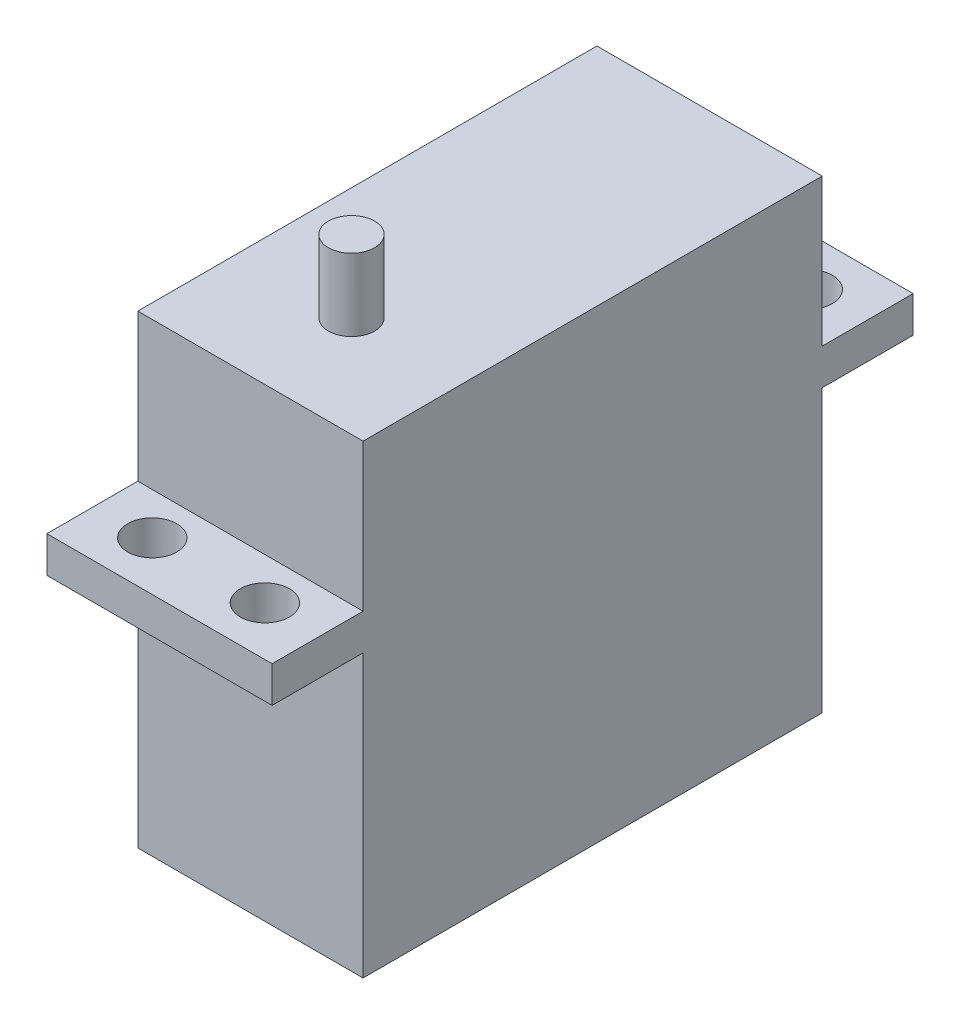
ISO-10303-21;
HEADER;
FILE_DESCRIPTION(('STEP AP214'),'2;1');
FILE_NAME('part.step','',(''),(''),'','','');
FILE_SCHEMA(('AUTOMOTIVE_DESIGN { 1 0 10303 214 1 1 1 1 }'));
ENDSEC;
DATA;
#1=APPLICATION_CONTEXT('core data for automotive mechanical design processes');
#2=APPLICATION_PROTOCOL_DEFINITION('international standard','automotive_design',2000,#1);
#3=PRODUCT_CONTEXT('',#1,'mechanical');
#4=PRODUCT('Part','Part','',(#3));
#5=PRODUCT_RELATED_PRODUCT_CATEGORY('part','',(#4));
#6=PRODUCT_DEFINITION_FORMATION('','',#4);
#7=PRODUCT_DEFINITION_CONTEXT('part definition',#1,'design');
#8=PRODUCT_DEFINITION('design','',#6,#7);
#9=PRODUCT_DEFINITION_SHAPE('','',#8);
#10=(LENGTH_UNIT() NAMED_UNIT(*) SI_UNIT(.MILLI.,.METRE.));
#11=(NAMED_UNIT(*) PLANE_ANGLE_UNIT() SI_UNIT($,.RADIAN.));
#12=(NAMED_UNIT(*) SI_UNIT($,.STERADIAN.) SOLID_ANGLE_UNIT());
#13=UNCERTAINTY_MEASURE_WITH_UNIT(LENGTH_MEASURE(1.E-05),#10,'distance_accuracy_value','');
#14=(GEOMETRIC_REPRESENTATION_CONTEXT(3) GLOBAL_UNCERTAINTY_ASSIGNED_CONTEXT((#13)) GLOBAL_UNIT_ASSIGNED_CONTEXT((#10,
#11,#12)) REPRESENTATION_CONTEXT('',''));
#15=CARTESIAN_POINT('',(0.,0.,0.));
#16=DIRECTION('',(0.,0.,1.));
#17=DIRECTION('',(1.,0.,0.));
#18=AXIS2_PLACEMENT_3D('',#15,#16,#17);
#19=CARTESIAN_POINT('',(9.906,20.447,-20.193));
#20=DIRECTION('',(0.,0.,1.));
#21=DIRECTION('',(0.,-1.,0.));
#22=AXIS2_PLACEMENT_3D('',#19,#20,#21);
#23=PLANE('',#22);
#24=DIRECTION('',(0.,1.,0.));
#25=VECTOR('',#24,1.);
#26=CARTESIAN_POINT('',(-9.906,20.447,-20.193));
#27=LINE('',#26,#25);
#28=CARTESIAN_POINT('',(-9.906,-20.447,-20.193));
#29=VERTEX_POINT('',#28);
#30=CARTESIAN_POINT('',(-9.906,4.318,-20.193));
#31=VERTEX_POINT('',#30);
#32=EDGE_CURVE('E208',#29,#31,#27,.T.);
#33=ORIENTED_EDGE('',*,*,#32,.T.);
#34=DIRECTION('',(1.,0.,0.));
#35=VECTOR('',#34,1.);
#36=CARTESIAN_POINT('',(9.906,4.318,-20.193));
#37=LINE('',#36,#35);
#38=CARTESIAN_POINT('',(9.906,4.318,-20.193));
#39=VERTEX_POINT('',#38);
#40=EDGE_CURVE('E192',#31,#39,#37,.T.);
#41=ORIENTED_EDGE('',*,*,#40,.T.);
#42=DIRECTION('',(0.,1.,0.));
#43=VECTOR('',#42,1.);
#44=CARTESIAN_POINT('',(9.906,20.447,-20.193));
#45=LINE('',#44,#43);
#46=CARTESIAN_POINT('',(9.906,-20.447,-20.193));
#47=VERTEX_POINT('',#46);
#48=EDGE_CURVE('E195',#47,#39,#45,.T.);
#49=ORIENTED_EDGE('',*,*,#48,.F.);
#50=DIRECTION('',(-1.,0.,0.));
#51=VECTOR('',#50,1.);
#52=CARTESIAN_POINT('',(9.906,-20.447,-20.193));
#53=LINE('',#52,#51);
#54=EDGE_CURVE('E207',#47,#29,#53,.T.);
#55=ORIENTED_EDGE('',*,*,#54,.T.);
#56=EDGE_LOOP('',(#33,#41,#49,#55));
#57=FACE_BOUND('',#56,.T.);
#58=ADVANCED_FACE('F47',(#57),#23,.F.);
#59=CARTESIAN_POINT('',(9.906,20.447,20.193));
#60=DIRECTION('',(0.,0.,-1.));
#61=DIRECTION('',(-1.,0.,0.));
#62=AXIS2_PLACEMENT_3D('',#59,#60,#61);
#63=PLANE('',#62);
#64=DIRECTION('',(0.,-1.,0.));
#65=VECTOR('',#64,1.);
#66=CARTESIAN_POINT('',(9.906,20.447,20.193));
#67=LINE('',#66,#65);
#68=CARTESIAN_POINT('',(9.906,4.318,20.193));
#69=VERTEX_POINT('',#68);
#70=CARTESIAN_POINT('',(9.906,-20.447,20.193));
#71=VERTEX_POINT('',#70);
#72=EDGE_CURVE('E201',#69,#71,#67,.T.);
#73=ORIENTED_EDGE('',*,*,#72,.F.);
#74=DIRECTION('',(-1.,0.,0.));
#75=VECTOR('',#74,1.);
#76=CARTESIAN_POINT('',(9.906,4.318,20.193));
#77=LINE('',#76,#75);
#78=CARTESIAN_POINT('',(-9.906,4.318,20.193));
#79=VERTEX_POINT('',#78);
#80=EDGE_CURVE('E189',#69,#79,#77,.T.);
#81=ORIENTED_EDGE('',*,*,#80,.T.);
#82=DIRECTION('',(0.,-1.,0.));
#83=VECTOR('',#82,1.);
#84=CARTESIAN_POINT('',(-9.906,20.447,20.193));
#85=LINE('',#84,#83);
#86=CARTESIAN_POINT('',(-9.906,-20.447,20.193));
#87=VERTEX_POINT('',#86);
#88=EDGE_CURVE('E213',#79,#87,#85,.T.);
#89=ORIENTED_EDGE('',*,*,#88,.T.);
#90=DIRECTION('',(-1.,0.,0.));
#91=VECTOR('',#90,1.);
#92=CARTESIAN_POINT('',(9.906,-20.447,20.193));
#93=LINE('',#92,#91);
#94=EDGE_CURVE('E221',#71,#87,#93,.T.);
#95=ORIENTED_EDGE('',*,*,#94,.F.);
#96=EDGE_LOOP('',(#73,#81,#89,#95));
#97=FACE_BOUND('',#96,.T.);
#98=ADVANCED_FACE('F250',(#97),#63,.F.);
#99=CARTESIAN_POINT('',(9.906,7.493,-20.193));
#100=VERTEX_POINT('',#99);
#101=CARTESIAN_POINT('',(9.906,20.447,-20.193));
#102=VERTEX_POINT('',#101);
#103=EDGE_CURVE('E199',#100,#102,#45,.T.);
#104=ORIENTED_EDGE('',*,*,#103,.F.);
#105=DIRECTION('',(-1.,0.,0.));
#106=VECTOR('',#105,1.);
#107=CARTESIAN_POINT('',(9.906,7.493,-20.193));
#108=LINE('',#107,#106);
#109=CARTESIAN_POINT('',(-9.906,7.493,-20.193));
#110=VERTEX_POINT('',#109);
#111=EDGE_CURVE('E187',#100,#110,#108,.T.);
#112=ORIENTED_EDGE('',*,*,#111,.T.);
#113=CARTESIAN_POINT('',(-9.906,20.447,-20.193));
#114=VERTEX_POINT('',#113);
#115=EDGE_CURVE('E153',#110,#114,#27,.T.);
#116=ORIENTED_EDGE('',*,*,#115,.T.);
#117=DIRECTION('',(-1.,0.,0.));
#118=VECTOR('',#117,1.);
#119=CARTESIAN_POINT('',(9.906,20.447,-20.193));
#120=LINE('',#119,#118);
#121=EDGE_CURVE('E55',#102,#114,#120,.T.);
#122=ORIENTED_EDGE('',*,*,#121,.F.);
#123=EDGE_LOOP('',(#104,#112,#116,#122));
#124=FACE_BOUND('',#123,.T.);
#125=ADVANCED_FACE('F49',(#124),#23,.F.);
#126=CARTESIAN_POINT('',(9.906,20.447,20.193));
#127=DIRECTION('',(0.,-1.,0.));
#128=DIRECTION('',(0.,0.,-1.));
#129=AXIS2_PLACEMENT_3D('',#126,#127,#128);
#130=PLANE('',#129);
#131=CARTESIAN_POINT('',(0.,20.447,11.303));
#132=DIRECTION('',(0.,-1.,0.));
#133=DIRECTION('',(0.,0.,-1.));
#134=AXIS2_PLACEMENT_3D('',#131,#132,#133);
#135=CIRCLE('',#134,2.032);
#136=CARTESIAN_POINT('',(0.,20.447,9.271));
#137=VERTEX_POINT('',#136);
#138=EDGE_CURVE('E11',#137,#137,#135,.F.);
#139=ORIENTED_EDGE('',*,*,#138,.F.);
#140=EDGE_LOOP('',(#139));
#141=FACE_BOUND('',#140,.T.);
#142=DIRECTION('',(0.,0.,1.));
#143=VECTOR('',#142,1.);
#144=CARTESIAN_POINT('',(-9.906,20.447,20.193));
#145=LINE('',#144,#143);
#146=CARTESIAN_POINT('',(-9.906,20.447,20.193));
#147=VERTEX_POINT('',#146);
#148=EDGE_CURVE('E211',#114,#147,#145,.T.);
#149=ORIENTED_EDGE('',*,*,#148,.T.);
#150=DIRECTION('',(-1.,0.,0.));
#151=VECTOR('',#150,1.);
#152=CARTESIAN_POINT('',(9.906,20.447,20.193));
#153=LINE('',#152,#151);
#154=CARTESIAN_POINT('',(9.906,20.447,20.193));
#155=VERTEX_POINT('',#154);
#156=EDGE_CURVE('E224',#155,#147,#153,.T.);
#157=ORIENTED_EDGE('',*,*,#156,.F.);
#158=DIRECTION('',(0.,0.,1.));
#159=VECTOR('',#158,1.);
#160=CARTESIAN_POINT('',(9.906,20.447,20.193));
#161=LINE('',#160,#159);
#162=EDGE_CURVE('E198',#102,#155,#161,.T.);
#163=ORIENTED_EDGE('',*,*,#162,.F.);
#164=ORIENTED_EDGE('',*,*,#121,.T.);
#165=EDGE_LOOP('',(#149,#157,#163,#164));
#166=FACE_BOUND('',#165,.T.);
#167=ADVANCED_FACE('F277',(#141,#166),#130,.F.);
#168=CARTESIAN_POINT('',(-9.906,7.493,20.193));
#169=VERTEX_POINT('',#168);
#170=EDGE_CURVE('E214',#147,#169,#85,.T.);
#171=ORIENTED_EDGE('',*,*,#170,.T.);
#172=DIRECTION('',(1.,0.,0.));
#173=VECTOR('',#172,1.);
#174=CARTESIAN_POINT('',(9.906,7.493,20.193));
#175=LINE('',#174,#173);
#176=CARTESIAN_POINT('',(9.906,7.493,20.193));
#177=VERTEX_POINT('',#176);
#178=EDGE_CURVE('E180',#169,#177,#175,.T.);
#179=ORIENTED_EDGE('',*,*,#178,.T.);
#180=EDGE_CURVE('E202',#155,#177,#67,.T.);
#181=ORIENTED_EDGE('',*,*,#180,.F.);
#182=ORIENTED_EDGE('',*,*,#156,.T.);
#183=EDGE_LOOP('',(#171,#179,#181,#182));
#184=FACE_BOUND('',#183,.T.);
#185=ADVANCED_FACE('F271',(#184),#63,.F.);
#186=CARTESIAN_POINT('',(9.906,-20.447,20.193));
#187=DIRECTION('',(0.,1.,0.));
#188=DIRECTION('',(0.,0.,1.));
#189=AXIS2_PLACEMENT_3D('',#186,#187,#188);
#190=PLANE('',#189);
#191=DIRECTION('',(0.,0.,-1.));
#192=VECTOR('',#191,1.);
#193=CARTESIAN_POINT('',(-9.906,-20.447,20.193));
#194=LINE('',#193,#192);
#195=EDGE_CURVE('E217',#87,#29,#194,.T.);
#196=ORIENTED_EDGE('',*,*,#195,.T.);
#197=ORIENTED_EDGE('',*,*,#54,.F.);
#198=DIRECTION('',(0.,0.,-1.));
#199=VECTOR('',#198,1.);
#200=CARTESIAN_POINT('',(9.906,-20.447,20.193));
#201=LINE('',#200,#199);
#202=EDGE_CURVE('E205',#71,#47,#201,.T.);
#203=ORIENTED_EDGE('',*,*,#202,.F.);
#204=ORIENTED_EDGE('',*,*,#94,.T.);
#205=EDGE_LOOP('',(#196,#197,#203,#204));
#206=FACE_BOUND('',#205,.T.);
#207=ADVANCED_FACE('F256',(#206),#190,.F.);
#208=CARTESIAN_POINT('',(9.906,0.,0.));
#209=DIRECTION('',(1.,0.,0.));
#210=DIRECTION('',(0.,0.,-1.));
#211=AXIS2_PLACEMENT_3D('',#208,#209,#210);
#212=PLANE('',#211);
#213=ORIENTED_EDGE('',*,*,#180,.T.);
#214=DIRECTION('',(0.,0.,1.));
#215=VECTOR('',#214,1.);
#216=CARTESIAN_POINT('',(9.906,7.493,28.194));
#217=LINE('',#216,#215);
#218=CARTESIAN_POINT('',(9.906,7.493,28.194));
#219=VERTEX_POINT('',#218);
#220=EDGE_CURVE('E174',#177,#219,#217,.T.);
#221=ORIENTED_EDGE('',*,*,#220,.T.);
#222=DIRECTION('',(0.,-1.,0.));
#223=VECTOR('',#222,1.);
#224=CARTESIAN_POINT('',(9.906,4.318,28.194));
#225=LINE('',#224,#223);
#226=CARTESIAN_POINT('',(9.906,4.318,28.194));
#227=VERTEX_POINT('',#226);
#228=EDGE_CURVE('E177',#219,#227,#225,.T.);
#229=ORIENTED_EDGE('',*,*,#228,.T.);
#230=DIRECTION('',(0.,0.,-1.));
#231=VECTOR('',#230,1.);
#232=CARTESIAN_POINT('',(9.906,4.318,28.194));
#233=LINE('',#232,#231);
#234=EDGE_CURVE('E62',#227,#69,#233,.T.);
#235=ORIENTED_EDGE('',*,*,#234,.T.);
#236=ORIENTED_EDGE('',*,*,#72,.T.);
#237=ORIENTED_EDGE('',*,*,#202,.T.);
#238=ORIENTED_EDGE('',*,*,#48,.T.);
#239=CARTESIAN_POINT('',(9.906,4.318,-28.194));
#240=VERTEX_POINT('',#239);
#241=EDGE_CURVE('E162',#39,#240,#233,.T.);
#242=ORIENTED_EDGE('',*,*,#241,.T.);
#243=DIRECTION('',(0.,1.,0.));
#244=VECTOR('',#243,1.);
#245=CARTESIAN_POINT('',(9.906,4.318,-28.194));
#246=LINE('',#245,#244);
#247=CARTESIAN_POINT('',(9.906,7.493,-28.194));
#248=VERTEX_POINT('',#247);
#249=EDGE_CURVE('E172',#240,#248,#246,.T.);
#250=ORIENTED_EDGE('',*,*,#249,.T.);
#251=EDGE_CURVE('E69',#248,#100,#217,.T.);
#252=ORIENTED_EDGE('',*,*,#251,.T.);
#253=ORIENTED_EDGE('',*,*,#103,.T.);
#254=ORIENTED_EDGE('',*,*,#162,.T.);
#255=EDGE_LOOP('',(#213,#221,#229,#235,#236,#237,#238,#242,#250,#252,#253,#254));
#256=FACE_BOUND('',#255,.T.);
#257=ADVANCED_FACE('F252',(#256),#212,.T.);
#258=CARTESIAN_POINT('',(-9.906,0.,0.));
#259=DIRECTION('',(1.,0.,0.));
#260=DIRECTION('',(0.,0.,-1.));
#261=AXIS2_PLACEMENT_3D('',#258,#259,#260);
#262=PLANE('',#261);
#263=ORIENTED_EDGE('',*,*,#115,.F.);
#264=DIRECTION('',(0.,0.,1.));
#265=VECTOR('',#264,1.);
#266=CARTESIAN_POINT('',(-9.906,7.493,28.194));
#267=LINE('',#266,#265);
#268=CARTESIAN_POINT('',(-9.906,7.493,-28.194));
#269=VERTEX_POINT('',#268);
#270=EDGE_CURVE('E138',#269,#110,#267,.T.);
#271=ORIENTED_EDGE('',*,*,#270,.F.);
#272=DIRECTION('',(0.,1.,0.));
#273=VECTOR('',#272,1.);
#274=CARTESIAN_POINT('',(-9.906,4.318,-28.194));
#275=LINE('',#274,#273);
#276=CARTESIAN_POINT('',(-9.906,4.318,-28.194));
#277=VERTEX_POINT('',#276);
#278=EDGE_CURVE('E151',#277,#269,#275,.T.);
#279=ORIENTED_EDGE('',*,*,#278,.F.);
#280=DIRECTION('',(0.,0.,-1.));
#281=VECTOR('',#280,1.);
#282=CARTESIAN_POINT('',(-9.906,4.318,28.194));
#283=LINE('',#282,#281);
#284=EDGE_CURVE('E170',#31,#277,#283,.T.);
#285=ORIENTED_EDGE('',*,*,#284,.F.);
#286=ORIENTED_EDGE('',*,*,#32,.F.);
#287=ORIENTED_EDGE('',*,*,#195,.F.);
#288=ORIENTED_EDGE('',*,*,#88,.F.);
#289=CARTESIAN_POINT('',(-9.906,4.318,28.194));
#290=VERTEX_POINT('',#289);
#291=EDGE_CURVE('E144',#290,#79,#283,.T.);
#292=ORIENTED_EDGE('',*,*,#291,.F.);
#293=DIRECTION('',(0.,-1.,0.));
#294=VECTOR('',#293,1.);
#295=CARTESIAN_POINT('',(-9.906,4.318,28.194));
#296=LINE('',#295,#294);
#297=CARTESIAN_POINT('',(-9.906,7.493,28.194));
#298=VERTEX_POINT('',#297);
#299=EDGE_CURVE('E154',#298,#290,#296,.T.);
#300=ORIENTED_EDGE('',*,*,#299,.F.);
#301=EDGE_CURVE('E155',#169,#298,#267,.T.);
#302=ORIENTED_EDGE('',*,*,#301,.F.);
#303=ORIENTED_EDGE('',*,*,#170,.F.);
#304=ORIENTED_EDGE('',*,*,#148,.F.);
#305=EDGE_LOOP('',(#263,#271,#279,#285,#286,#287,#288,#292,#300,#302,#303,#304));
#306=FACE_BOUND('',#305,.T.);
#307=ADVANCED_FACE('F149',(#306),#262,.F.);
#308=CARTESIAN_POINT('',(-9.906,4.318,28.194));
#309=DIRECTION('',(0.,0.,1.));
#310=DIRECTION('',(1.,0.,0.));
#311=AXIS2_PLACEMENT_3D('',#308,#309,#310);
#312=PLANE('',#311);
#313=ORIENTED_EDGE('',*,*,#228,.F.);
#314=DIRECTION('',(1.,0.,0.));
#315=VECTOR('',#314,1.);
#316=CARTESIAN_POINT('',(-9.906,7.493,28.194));
#317=LINE('',#316,#315);
#318=EDGE_CURVE('E143',#298,#219,#317,.T.);
#319=ORIENTED_EDGE('',*,*,#318,.F.);
#320=ORIENTED_EDGE('',*,*,#299,.T.);
#321=DIRECTION('',(1.,0.,0.));
#322=VECTOR('',#321,1.);
#323=CARTESIAN_POINT('',(-9.906,4.318,28.194));
#324=LINE('',#323,#322);
#325=EDGE_CURVE('E181',#290,#227,#324,.T.);
#326=ORIENTED_EDGE('',*,*,#325,.T.);
#327=EDGE_LOOP('',(#313,#319,#320,#326));
#328=FACE_BOUND('',#327,.T.);
#329=ADVANCED_FACE('F267',(#328),#312,.T.);
#330=CARTESIAN_POINT('',(-9.906,7.493,28.194));
#331=DIRECTION('',(0.,1.,0.));
#332=DIRECTION('',(0.,0.,1.));
#333=AXIS2_PLACEMENT_3D('',#330,#331,#332);
#334=PLANE('',#333);
#335=CARTESIAN_POINT('',(-4.953,7.493,23.876));
#336=DIRECTION('',(0.,1.,0.));
#337=DIRECTION('',(0.,0.,1.));
#338=AXIS2_PLACEMENT_3D('',#335,#336,#337);
#339=CIRCLE('',#338,2.159);
#340=CARTESIAN_POINT('',(-4.953,7.493,26.035));
#341=VERTEX_POINT('',#340);
#342=EDGE_CURVE('E508',#341,#341,#339,.T.);
#343=ORIENTED_EDGE('',*,*,#342,.F.);
#344=EDGE_LOOP('',(#343));
#345=FACE_BOUND('',#344,.T.);
#346=CARTESIAN_POINT('',(4.953,7.493,23.876));
#347=DIRECTION('',(0.,1.,0.));
#348=DIRECTION('',(0.,0.,1.));
#349=AXIS2_PLACEMENT_3D('',#346,#347,#348);
#350=CIRCLE('',#349,2.159);
#351=CARTESIAN_POINT('',(4.953,7.493,26.035));
#352=VERTEX_POINT('',#351);
#353=EDGE_CURVE('E511',#352,#352,#350,.T.);
#354=ORIENTED_EDGE('',*,*,#353,.F.);
#355=EDGE_LOOP('',(#354));
#356=FACE_BOUND('',#355,.T.);
#357=ORIENTED_EDGE('',*,*,#178,.F.);
#358=ORIENTED_EDGE('',*,*,#301,.T.);
#359=ORIENTED_EDGE('',*,*,#318,.T.);
#360=ORIENTED_EDGE('',*,*,#220,.F.);
#361=EDGE_LOOP('',(#357,#358,#359,#360));
#362=FACE_BOUND('',#361,.T.);
#363=ADVANCED_FACE('F241',(#345,#356,#362),#334,.T.);
#364=CARTESIAN_POINT('',(-9.906,4.318,28.194));
#365=DIRECTION('',(0.,-1.,0.));
#366=DIRECTION('',(0.,0.,-1.));
#367=AXIS2_PLACEMENT_3D('',#364,#365,#366);
#368=PLANE('',#367);
#369=CARTESIAN_POINT('',(-4.953,4.318,23.876));
#370=DIRECTION('',(0.,-1.,0.));
#371=DIRECTION('',(0.,0.,-1.));
#372=AXIS2_PLACEMENT_3D('',#369,#370,#371);
#373=CIRCLE('',#372,2.159);
#374=CARTESIAN_POINT('',(-4.953,4.318,21.717));
#375=VERTEX_POINT('',#374);
#376=EDGE_CURVE('E175',#375,#375,#373,.T.);
#377=ORIENTED_EDGE('',*,*,#376,.F.);
#378=EDGE_LOOP('',(#377));
#379=FACE_BOUND('',#378,.T.);
#380=CARTESIAN_POINT('',(4.953,4.318,23.876));
#381=DIRECTION('',(0.,-1.,0.));
#382=DIRECTION('',(0.,0.,-1.));
#383=AXIS2_PLACEMENT_3D('',#380,#381,#382);
#384=CIRCLE('',#383,2.159);
#385=CARTESIAN_POINT('',(4.953,4.318,21.717));
#386=VERTEX_POINT('',#385);
#387=EDGE_CURVE('E229',#386,#386,#384,.T.);
#388=ORIENTED_EDGE('',*,*,#387,.F.);
#389=EDGE_LOOP('',(#388));
#390=FACE_BOUND('',#389,.T.);
#391=ORIENTED_EDGE('',*,*,#80,.F.);
#392=ORIENTED_EDGE('',*,*,#234,.F.);
#393=ORIENTED_EDGE('',*,*,#325,.F.);
#394=ORIENTED_EDGE('',*,*,#291,.T.);
#395=EDGE_LOOP('',(#391,#392,#393,#394));
#396=FACE_BOUND('',#395,.T.);
#397=ADVANCED_FACE('F237',(#379,#390,#396),#368,.T.);
#398=CARTESIAN_POINT('',(4.953,4.318,-23.876));
#399=DIRECTION('',(0.,-1.,0.));
#400=DIRECTION('',(0.,0.,-1.));
#401=AXIS2_PLACEMENT_3D('',#398,#399,#400);
#402=CIRCLE('',#401,2.159);
#403=CARTESIAN_POINT('',(4.953,4.318,-26.035));
#404=VERTEX_POINT('',#403);
#405=EDGE_CURVE('E165',#404,#404,#402,.T.);
#406=ORIENTED_EDGE('',*,*,#405,.F.);
#407=EDGE_LOOP('',(#406));
#408=FACE_BOUND('',#407,.T.);
#409=CARTESIAN_POINT('',(-4.953,4.318,-23.876));
#410=DIRECTION('',(0.,-1.,0.));
#411=DIRECTION('',(0.,0.,-1.));
#412=AXIS2_PLACEMENT_3D('',#409,#410,#411);
#413=CIRCLE('',#412,2.159);
#414=CARTESIAN_POINT('',(-4.953,4.318,-26.035));
#415=VERTEX_POINT('',#414);
#416=EDGE_CURVE('E523',#415,#415,#413,.T.);
#417=ORIENTED_EDGE('',*,*,#416,.F.);
#418=EDGE_LOOP('',(#417));
#419=FACE_BOUND('',#418,.T.);
#420=ORIENTED_EDGE('',*,*,#40,.F.);
#421=ORIENTED_EDGE('',*,*,#284,.T.);
#422=DIRECTION('',(1.,0.,0.));
#423=VECTOR('',#422,1.);
#424=CARTESIAN_POINT('',(-9.906,4.318,-28.194));
#425=LINE('',#424,#423);
#426=EDGE_CURVE('E160',#277,#240,#425,.T.);
#427=ORIENTED_EDGE('',*,*,#426,.T.);
#428=ORIENTED_EDGE('',*,*,#241,.F.);
#429=EDGE_LOOP('',(#420,#421,#427,#428));
#430=FACE_BOUND('',#429,.T.);
#431=ADVANCED_FACE('F240',(#408,#419,#430),#368,.T.);
#432=CARTESIAN_POINT('',(4.953,7.493,-23.876));
#433=DIRECTION('',(0.,1.,0.));
#434=DIRECTION('',(0.,0.,1.));
#435=AXIS2_PLACEMENT_3D('',#432,#433,#434);
#436=CIRCLE('',#435,2.159);
#437=CARTESIAN_POINT('',(4.953,7.493,-21.717));
#438=VERTEX_POINT('',#437);
#439=EDGE_CURVE('E513',#438,#438,#436,.T.);
#440=ORIENTED_EDGE('',*,*,#439,.F.);
#441=EDGE_LOOP('',(#440));
#442=FACE_BOUND('',#441,.T.);
#443=CARTESIAN_POINT('',(-4.953,7.493,-23.876));
#444=DIRECTION('',(0.,1.,0.));
#445=DIRECTION('',(0.,0.,1.));
#446=AXIS2_PLACEMENT_3D('',#443,#444,#445);
#447=CIRCLE('',#446,2.159);
#448=CARTESIAN_POINT('',(-4.953,7.493,-21.717));
#449=VERTEX_POINT('',#448);
#450=EDGE_CURVE('E516',#449,#449,#447,.T.);
#451=ORIENTED_EDGE('',*,*,#450,.F.);
#452=EDGE_LOOP('',(#451));
#453=FACE_BOUND('',#452,.T.);
#454=ORIENTED_EDGE('',*,*,#111,.F.);
#455=ORIENTED_EDGE('',*,*,#251,.F.);
#456=DIRECTION('',(1.,0.,0.));
#457=VECTOR('',#456,1.);
#458=CARTESIAN_POINT('',(-9.906,7.493,-28.194));
#459=LINE('',#458,#457);
#460=EDGE_CURVE('E135',#269,#248,#459,.T.);
#461=ORIENTED_EDGE('',*,*,#460,.F.);
#462=ORIENTED_EDGE('',*,*,#270,.T.);
#463=EDGE_LOOP('',(#454,#455,#461,#462));
#464=FACE_BOUND('',#463,.T.);
#465=ADVANCED_FACE('F137',(#442,#453,#464),#334,.T.);
#466=CARTESIAN_POINT('',(-9.906,4.318,-28.194));
#467=DIRECTION('',(0.,0.,-1.));
#468=DIRECTION('',(-1.,0.,0.));
#469=AXIS2_PLACEMENT_3D('',#466,#467,#468);
#470=PLANE('',#469);
#471=ORIENTED_EDGE('',*,*,#249,.F.);
#472=ORIENTED_EDGE('',*,*,#426,.F.);
#473=ORIENTED_EDGE('',*,*,#278,.T.);
#474=ORIENTED_EDGE('',*,*,#460,.T.);
#475=EDGE_LOOP('',(#471,#472,#473,#474));
#476=FACE_BOUND('',#475,.T.);
#477=ADVANCED_FACE('F158',(#476),#470,.T.);
#478=CARTESIAN_POINT('',(-4.953,-12.319,-23.876));
#479=DIRECTION('',(0.,1.,0.));
#480=DIRECTION('',(0.,0.,1.));
#481=AXIS2_PLACEMENT_3D('',#478,#479,#480);
#482=CYLINDRICAL_SURFACE('',#481,2.159);
#483=ORIENTED_EDGE('',*,*,#416,.T.);
#484=EDGE_LOOP('',(#483));
#485=FACE_BOUND('',#484,.T.);
#486=ORIENTED_EDGE('',*,*,#450,.T.);
#487=EDGE_LOOP('',(#486));
#488=FACE_BOUND('',#487,.T.);
#489=ADVANCED_FACE('F388',(#485,#488),#482,.F.);
#490=CARTESIAN_POINT('',(4.953,-12.319,-23.876));
#491=DIRECTION('',(0.,1.,0.));
#492=DIRECTION('',(0.,0.,1.));
#493=AXIS2_PLACEMENT_3D('',#490,#491,#492);
#494=CYLINDRICAL_SURFACE('',#493,2.159);
#495=ORIENTED_EDGE('',*,*,#405,.T.);
#496=EDGE_LOOP('',(#495));
#497=FACE_BOUND('',#496,.T.);
#498=ORIENTED_EDGE('',*,*,#439,.T.);
#499=EDGE_LOOP('',(#498));
#500=FACE_BOUND('',#499,.T.);
#501=ADVANCED_FACE('F379',(#497,#500),#494,.F.);
#502=CARTESIAN_POINT('',(4.953,-12.319,23.876));
#503=DIRECTION('',(0.,1.,0.));
#504=DIRECTION('',(0.,0.,1.));
#505=AXIS2_PLACEMENT_3D('',#502,#503,#504);
#506=CYLINDRICAL_SURFACE('',#505,2.159);
#507=ORIENTED_EDGE('',*,*,#387,.T.);
#508=EDGE_LOOP('',(#507));
#509=FACE_BOUND('',#508,.T.);
#510=ORIENTED_EDGE('',*,*,#353,.T.);
#511=EDGE_LOOP('',(#510));
#512=FACE_BOUND('',#511,.T.);
#513=ADVANCED_FACE('F371',(#509,#512),#506,.F.);
#514=CARTESIAN_POINT('',(-4.953,-12.319,23.876));
#515=DIRECTION('',(0.,1.,0.));
#516=DIRECTION('',(0.,0.,1.));
#517=AXIS2_PLACEMENT_3D('',#514,#515,#516);
#518=CYLINDRICAL_SURFACE('',#517,2.159);
#519=ORIENTED_EDGE('',*,*,#376,.T.);
#520=EDGE_LOOP('',(#519));
#521=FACE_BOUND('',#520,.T.);
#522=ORIENTED_EDGE('',*,*,#342,.T.);
#523=EDGE_LOOP('',(#522));
#524=FACE_BOUND('',#523,.T.);
#525=ADVANCED_FACE('F234',(#521,#524),#518,.F.);
#526=CARTESIAN_POINT('',(0.,26.797,11.303));
#527=DIRECTION('',(0.,-1.,0.));
#528=DIRECTION('',(0.,0.,-1.));
#529=AXIS2_PLACEMENT_3D('',#526,#527,#528);
#530=CYLINDRICAL_SURFACE('',#529,2.032);
#531=CARTESIAN_POINT('',(0.,26.797,11.303));
#532=DIRECTION('',(0.,1.,0.));
#533=DIRECTION('',(0.,0.,1.));
#534=AXIS2_PLACEMENT_3D('',#531,#532,#533);
#535=CIRCLE('',#534,2.032);
#536=CARTESIAN_POINT('',(0.,26.797,13.335));
#537=VERTEX_POINT('',#536);
#538=EDGE_CURVE('E518',#537,#537,#535,.T.);
#539=ORIENTED_EDGE('',*,*,#538,.F.);
#540=EDGE_LOOP('',(#539));
#541=FACE_BOUND('',#540,.T.);
#542=ORIENTED_EDGE('',*,*,#138,.T.);
#543=EDGE_LOOP('',(#542));
#544=FACE_BOUND('',#543,.T.);
#545=ADVANCED_FACE('F333',(#541,#544),#530,.T.);
#546=CARTESIAN_POINT('',(0.,26.797,11.303));
#547=DIRECTION('',(0.,1.,0.));
#548=DIRECTION('',(0.,0.,1.));
#549=AXIS2_PLACEMENT_3D('',#546,#547,#548);
#550=PLANE('',#549);
#551=ORIENTED_EDGE('',*,*,#538,.T.);
#552=EDGE_LOOP('',(#551));
#553=FACE_BOUND('',#552,.T.);
#554=ADVANCED_FACE('F336',(#553),#550,.T.);
#555=CLOSED_SHELL('',(#58,#98,#125,#167,#185,#207,#257,#307,#329,#363,#397,#431,#465,#477,#489,
#501,#513,#525,#545,#554));
#556=MANIFOLD_SOLID_BREP('B2',#555);
#557=ADVANCED_BREP_SHAPE_REPRESENTATION('',(#18,#556),#14);
#558=SHAPE_DEFINITION_REPRESENTATION(#9,#557);
ENDSEC;
END-ISO-10303-21;
